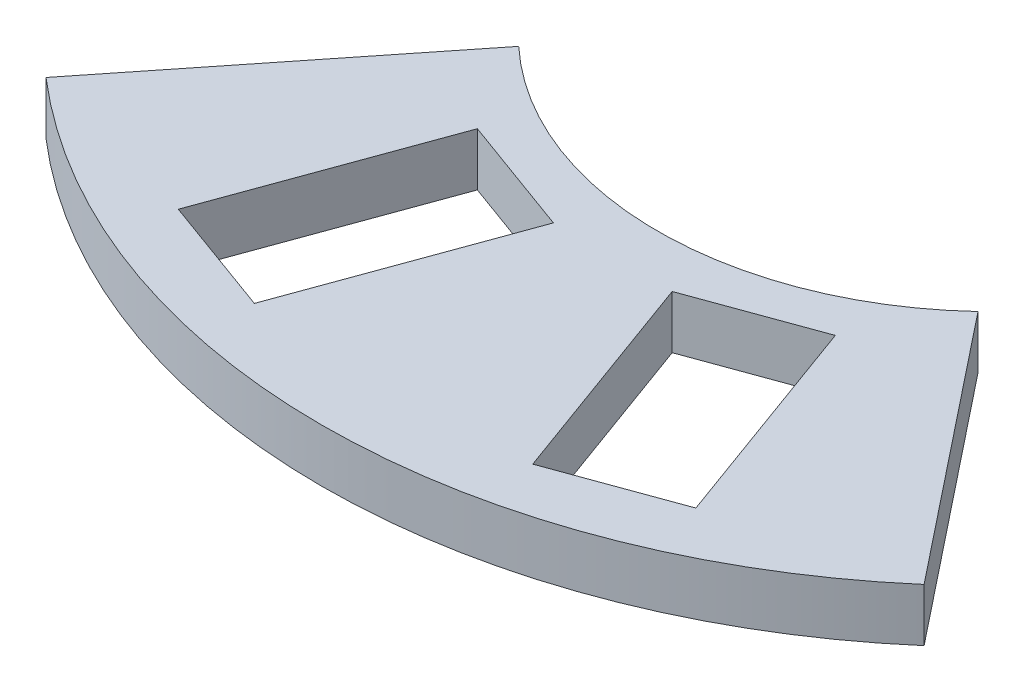
ISO-10303-21;
HEADER;
FILE_DESCRIPTION(('STEP AP214'),'2;1');
FILE_NAME('part.step','',(''),(''),'','','');
FILE_SCHEMA(('AUTOMOTIVE_DESIGN { 1 0 10303 214 1 1 1 1 }'));
ENDSEC;
DATA;
#1=APPLICATION_CONTEXT('core data for automotive mechanical design processes');
#2=APPLICATION_PROTOCOL_DEFINITION('international standard','automotive_design',2000,#1);
#3=PRODUCT_CONTEXT('',#1,'mechanical');
#4=PRODUCT('Part','Part','',(#3));
#5=PRODUCT_RELATED_PRODUCT_CATEGORY('part','',(#4));
#6=PRODUCT_DEFINITION_FORMATION('','',#4);
#7=PRODUCT_DEFINITION_CONTEXT('part definition',#1,'design');
#8=PRODUCT_DEFINITION('design','',#6,#7);
#9=PRODUCT_DEFINITION_SHAPE('','',#8);
#10=(LENGTH_UNIT() NAMED_UNIT(*) SI_UNIT(.MILLI.,.METRE.));
#11=(NAMED_UNIT(*) PLANE_ANGLE_UNIT() SI_UNIT($,.RADIAN.));
#12=(NAMED_UNIT(*) SI_UNIT($,.STERADIAN.) SOLID_ANGLE_UNIT());
#13=UNCERTAINTY_MEASURE_WITH_UNIT(LENGTH_MEASURE(1.E-05),#10,'distance_accuracy_value','');
#14=(GEOMETRIC_REPRESENTATION_CONTEXT(3) GLOBAL_UNCERTAINTY_ASSIGNED_CONTEXT((#13)) GLOBAL_UNIT_ASSIGNED_CONTEXT((#10,
#11,#12)) REPRESENTATION_CONTEXT('',''));
#15=CARTESIAN_POINT('',(0.,0.,0.));
#16=DIRECTION('',(0.,0.,1.));
#17=DIRECTION('',(1.,0.,0.));
#18=AXIS2_PLACEMENT_3D('',#15,#16,#17);
#19=CARTESIAN_POINT('',(0.,5.,-46.3080738993349));
#20=DIRECTION('',(0.,-1.,0.));
#21=DIRECTION('',(0.,0.,-1.));
#22=AXIS2_PLACEMENT_3D('',#19,#20,#21);
#23=PLANE('',#22);
#24=DIRECTION('',(0.342020143325669,0.,-0.939692620785908));
#25=VECTOR('',#24,1.);
#26=CARTESIAN_POINT('',(-13.1240658518669,5.,10.3216930332881));
#27=LINE('',#26,#25);
#28=CARTESIAN_POINT('',(-13.1240658518669,5.,10.3216930332881));
#29=VERTEX_POINT('',#28);
#30=CARTESIAN_POINT('',(-5.59962269870219,5.,-10.3515446240019));
#31=VERTEX_POINT('',#30);
#32=EDGE_CURVE('E161',#29,#31,#27,.T.);
#33=ORIENTED_EDGE('',*,*,#32,.F.);
#34=DIRECTION('',(0.939692620785908,0.,0.342020143325669));
#35=VECTOR('',#34,1.);
#36=CARTESIAN_POINT('',(-24.4003773012978,5.,6.21745131338006));
#37=LINE('',#36,#35);
#38=CARTESIAN_POINT('',(-24.4003773012978,5.,6.21745131338007));
#39=VERTEX_POINT('',#38);
#40=EDGE_CURVE('E169',#39,#29,#37,.T.);
#41=ORIENTED_EDGE('',*,*,#40,.F.);
#42=DIRECTION('',(-0.342020143325669,0.,0.939692620785908));
#43=VECTOR('',#42,1.);
#44=CARTESIAN_POINT('',(-24.4003773012978,5.,6.21745131338006));
#45=LINE('',#44,#43);
#46=CARTESIAN_POINT('',(-16.8759341481331,5.,-14.4557863439099));
#47=VERTEX_POINT('',#46);
#48=EDGE_CURVE('E166',#47,#39,#45,.T.);
#49=ORIENTED_EDGE('',*,*,#48,.F.);
#50=DIRECTION('',(-0.939692620785908,0.,-0.342020143325669));
#51=VECTOR('',#50,1.);
#52=CARTESIAN_POINT('',(-16.8759341481331,5.,-14.4557863439099));
#53=LINE('',#52,#51);
#54=EDGE_CURVE('E163',#31,#47,#53,.T.);
#55=ORIENTED_EDGE('',*,*,#54,.F.);
#56=EDGE_LOOP('',(#33,#41,#49,#55));
#57=FACE_BOUND('',#56,.T.);
#58=CARTESIAN_POINT('',(0.,5.,-46.3080738993349));
#59=DIRECTION('',(0.,-1.,0.));
#60=DIRECTION('',(0.,0.,-1.));
#61=AXIS2_PLACEMENT_3D('',#58,#59,#60);
#62=CIRCLE('',#61,31.7184001686182);
#63=CARTESIAN_POINT('',(21.6538678723969,5.,-23.1312122605932));
#64=VERTEX_POINT('',#63);
#65=CARTESIAN_POINT('',(-21.6538678723969,5.,-23.1312122605932));
#66=VERTEX_POINT('',#65);
#67=EDGE_CURVE('E192',#64,#66,#62,.T.);
#68=ORIENTED_EDGE('',*,*,#67,.T.);
#69=DIRECTION('',(-0.622418773256574,0.,0.782684400443616));
#70=VECTOR('',#69,1.);
#71=CARTESIAN_POINT('',(-21.6538678723969,5.,-23.1312122605932));
#72=LINE('',#71,#70);
#73=CARTESIAN_POINT('',(-41.3970299545099,5.,1.6955854535077));
#74=VERTEX_POINT('',#73);
#75=EDGE_CURVE('E195',#66,#74,#72,.T.);
#76=ORIENTED_EDGE('',*,*,#75,.T.);
#77=CARTESIAN_POINT('',(0.,5.,-46.3080738993349));
#78=DIRECTION('',(0.,1.,0.));
#79=DIRECTION('',(0.,0.,-1.));
#80=AXIS2_PLACEMENT_3D('',#77,#78,#79);
#81=CIRCLE('',#80,63.3882118403599);
#82=CARTESIAN_POINT('',(41.3970299545099,5.,1.69558545350768));
#83=VERTEX_POINT('',#82);
#84=EDGE_CURVE('E198',#74,#83,#81,.T.);
#85=ORIENTED_EDGE('',*,*,#84,.T.);
#86=DIRECTION('',(-0.622418773256574,0.,-0.782684400443616));
#87=VECTOR('',#86,1.);
#88=CARTESIAN_POINT('',(21.6538678723969,5.,-23.1312122605932));
#89=LINE('',#88,#87);
#90=EDGE_CURVE('E200',#83,#64,#89,.T.);
#91=ORIENTED_EDGE('',*,*,#90,.T.);
#92=EDGE_LOOP('',(#68,#76,#85,#91));
#93=FACE_BOUND('',#92,.T.);
#94=DIRECTION('',(-0.342020143325669,0.,-0.939692620785908));
#95=VECTOR('',#94,1.);
#96=CARTESIAN_POINT('',(24.4003773012978,5.,6.21745131338006));
#97=LINE('',#96,#95);
#98=CARTESIAN_POINT('',(24.4003773012978,5.,6.21745131338006));
#99=VERTEX_POINT('',#98);
#100=CARTESIAN_POINT('',(16.8759341481331,5.,-14.4557863439099));
#101=VERTEX_POINT('',#100);
#102=EDGE_CURVE('E125',#99,#101,#97,.T.);
#103=ORIENTED_EDGE('',*,*,#102,.F.);
#104=DIRECTION('',(0.939692620785908,0.,-0.342020143325669));
#105=VECTOR('',#104,1.);
#106=CARTESIAN_POINT('',(24.4003773012978,5.,6.21745131338006));
#107=LINE('',#106,#105);
#108=CARTESIAN_POINT('',(13.1240658518669,5.,10.3216930332881));
#109=VERTEX_POINT('',#108);
#110=EDGE_CURVE('E147',#109,#99,#107,.T.);
#111=ORIENTED_EDGE('',*,*,#110,.F.);
#112=DIRECTION('',(0.342020143325669,0.,0.939692620785908));
#113=VECTOR('',#112,1.);
#114=CARTESIAN_POINT('',(13.1240658518669,5.,10.3216930332881));
#115=LINE('',#114,#113);
#116=CARTESIAN_POINT('',(5.59962269870219,5.,-10.3515446240019));
#117=VERTEX_POINT('',#116);
#118=EDGE_CURVE('E145',#117,#109,#115,.T.);
#119=ORIENTED_EDGE('',*,*,#118,.F.);
#120=DIRECTION('',(-0.939692620785908,0.,0.342020143325669));
#121=VECTOR('',#120,1.);
#122=CARTESIAN_POINT('',(16.8759341481331,5.,-14.4557863439099));
#123=LINE('',#122,#121);
#124=EDGE_CURVE('E133',#101,#117,#123,.T.);
#125=ORIENTED_EDGE('',*,*,#124,.F.);
#126=EDGE_LOOP('',(#103,#111,#119,#125));
#127=FACE_BOUND('',#126,.T.);
#128=ADVANCED_FACE('F36',(#57,#93,#127),#23,.F.);
#129=CARTESIAN_POINT('',(0.,0.,-46.3080738993349));
#130=DIRECTION('',(0.,-1.,0.));
#131=DIRECTION('',(0.,0.,-1.));
#132=AXIS2_PLACEMENT_3D('',#129,#130,#131);
#133=PLANE('',#132);
#134=CARTESIAN_POINT('',(0.,0.,-46.3080738993349));
#135=DIRECTION('',(0.,-1.,0.));
#136=DIRECTION('',(0.,0.,-1.));
#137=AXIS2_PLACEMENT_3D('',#134,#135,#136);
#138=CIRCLE('',#137,31.7184001686182);
#139=CARTESIAN_POINT('',(21.6538678723969,0.,-23.1312122605932));
#140=VERTEX_POINT('',#139);
#141=CARTESIAN_POINT('',(-21.6538678723969,0.,-23.1312122605932));
#142=VERTEX_POINT('',#141);
#143=EDGE_CURVE('E191',#140,#142,#138,.T.);
#144=ORIENTED_EDGE('',*,*,#143,.F.);
#145=DIRECTION('',(-0.622418773256574,0.,-0.782684400443616));
#146=VECTOR('',#145,1.);
#147=CARTESIAN_POINT('',(21.6538678723969,0.,-23.1312122605932));
#148=LINE('',#147,#146);
#149=CARTESIAN_POINT('',(41.3970299545099,0.,1.69558545350768));
#150=VERTEX_POINT('',#149);
#151=EDGE_CURVE('E196',#150,#140,#148,.T.);
#152=ORIENTED_EDGE('',*,*,#151,.F.);
#153=CARTESIAN_POINT('',(0.,0.,-46.3080738993349));
#154=DIRECTION('',(0.,1.,0.));
#155=DIRECTION('',(0.,0.,-1.));
#156=AXIS2_PLACEMENT_3D('',#153,#154,#155);
#157=CIRCLE('',#156,63.3882118403599);
#158=CARTESIAN_POINT('',(-41.3970299545099,0.,1.6955854535077));
#159=VERTEX_POINT('',#158);
#160=EDGE_CURVE('E207',#159,#150,#157,.T.);
#161=ORIENTED_EDGE('',*,*,#160,.F.);
#162=DIRECTION('',(-0.622418773256574,0.,0.782684400443616));
#163=VECTOR('',#162,1.);
#164=CARTESIAN_POINT('',(-21.6538678723969,0.,-23.1312122605932));
#165=LINE('',#164,#163);
#166=EDGE_CURVE('E205',#142,#159,#165,.T.);
#167=ORIENTED_EDGE('',*,*,#166,.F.);
#168=EDGE_LOOP('',(#144,#152,#161,#167));
#169=FACE_BOUND('',#168,.T.);
#170=DIRECTION('',(0.939692620785908,0.,0.342020143325669));
#171=VECTOR('',#170,1.);
#172=CARTESIAN_POINT('',(-24.4003773012978,0.,6.21745131338006));
#173=LINE('',#172,#171);
#174=CARTESIAN_POINT('',(-24.4003773012978,0.,6.21745131338006));
#175=VERTEX_POINT('',#174);
#176=CARTESIAN_POINT('',(-13.1240658518669,0.,10.3216930332881));
#177=VERTEX_POINT('',#176);
#178=EDGE_CURVE('E164',#175,#177,#173,.T.);
#179=ORIENTED_EDGE('',*,*,#178,.T.);
#180=DIRECTION('',(0.342020143325669,0.,-0.939692620785908));
#181=VECTOR('',#180,1.);
#182=CARTESIAN_POINT('',(-13.1240658518669,0.,10.3216930332881));
#183=LINE('',#182,#181);
#184=CARTESIAN_POINT('',(-5.59962269870219,0.,-10.3515446240019));
#185=VERTEX_POINT('',#184);
#186=EDGE_CURVE('E141',#177,#185,#183,.T.);
#187=ORIENTED_EDGE('',*,*,#186,.T.);
#188=DIRECTION('',(-0.939692620785908,0.,-0.342020143325669));
#189=VECTOR('',#188,1.);
#190=CARTESIAN_POINT('',(-16.8759341481331,0.,-14.4557863439099));
#191=LINE('',#190,#189);
#192=CARTESIAN_POINT('',(-16.8759341481331,0.,-14.4557863439099));
#193=VERTEX_POINT('',#192);
#194=EDGE_CURVE('E174',#185,#193,#191,.T.);
#195=ORIENTED_EDGE('',*,*,#194,.T.);
#196=DIRECTION('',(-0.342020143325669,0.,0.939692620785908));
#197=VECTOR('',#196,1.);
#198=CARTESIAN_POINT('',(-24.4003773012978,0.,6.21745131338006));
#199=LINE('',#198,#197);
#200=EDGE_CURVE('E177',#193,#175,#199,.T.);
#201=ORIENTED_EDGE('',*,*,#200,.T.);
#202=EDGE_LOOP('',(#179,#187,#195,#201));
#203=FACE_BOUND('',#202,.T.);
#204=DIRECTION('',(0.939692620785908,0.,-0.342020143325669));
#205=VECTOR('',#204,1.);
#206=CARTESIAN_POINT('',(24.4003773012978,0.,6.21745131338006));
#207=LINE('',#206,#205);
#208=CARTESIAN_POINT('',(13.1240658518669,0.,10.3216930332881));
#209=VERTEX_POINT('',#208);
#210=CARTESIAN_POINT('',(24.4003773012978,0.,6.21745131338007));
#211=VERTEX_POINT('',#210);
#212=EDGE_CURVE('E134',#209,#211,#207,.T.);
#213=ORIENTED_EDGE('',*,*,#212,.T.);
#214=DIRECTION('',(-0.342020143325669,0.,-0.939692620785908));
#215=VECTOR('',#214,1.);
#216=CARTESIAN_POINT('',(24.4003773012978,0.,6.21745131338006));
#217=LINE('',#216,#215);
#218=CARTESIAN_POINT('',(16.8759341481331,0.,-14.4557863439099));
#219=VERTEX_POINT('',#218);
#220=EDGE_CURVE('E59',#211,#219,#217,.T.);
#221=ORIENTED_EDGE('',*,*,#220,.T.);
#222=DIRECTION('',(-0.939692620785908,0.,0.342020143325669));
#223=VECTOR('',#222,1.);
#224=CARTESIAN_POINT('',(16.8759341481331,0.,-14.4557863439099));
#225=LINE('',#224,#223);
#226=CARTESIAN_POINT('',(5.59962269870219,0.,-10.3515446240019));
#227=VERTEX_POINT('',#226);
#228=EDGE_CURVE('E140',#219,#227,#225,.T.);
#229=ORIENTED_EDGE('',*,*,#228,.T.);
#230=DIRECTION('',(0.342020143325669,0.,0.939692620785908));
#231=VECTOR('',#230,1.);
#232=CARTESIAN_POINT('',(13.1240658518669,0.,10.3216930332881));
#233=LINE('',#232,#231);
#234=EDGE_CURVE('E153',#227,#209,#233,.T.);
#235=ORIENTED_EDGE('',*,*,#234,.T.);
#236=EDGE_LOOP('',(#213,#221,#229,#235));
#237=FACE_BOUND('',#236,.T.);
#238=ADVANCED_FACE('F225',(#169,#203,#237),#133,.T.);
#239=CARTESIAN_POINT('',(0.,5.,-46.3080738993349));
#240=DIRECTION('',(0.,-1.,0.));
#241=DIRECTION('',(0.,0.,-1.));
#242=AXIS2_PLACEMENT_3D('',#239,#240,#241);
#243=CYLINDRICAL_SURFACE('',#242,31.7184001686182);
#244=ORIENTED_EDGE('',*,*,#143,.T.);
#245=DIRECTION('',(0.,-1.,0.));
#246=VECTOR('',#245,1.);
#247=CARTESIAN_POINT('',(-21.6538678723969,5.,-23.1312122605932));
#248=LINE('',#247,#246);
#249=EDGE_CURVE('E11',#66,#142,#248,.T.);
#250=ORIENTED_EDGE('',*,*,#249,.F.);
#251=ORIENTED_EDGE('',*,*,#67,.F.);
#252=DIRECTION('',(0.,-1.,0.));
#253=VECTOR('',#252,1.);
#254=CARTESIAN_POINT('',(21.6538678723969,5.,-23.1312122605932));
#255=LINE('',#254,#253);
#256=EDGE_CURVE('E202',#64,#140,#255,.T.);
#257=ORIENTED_EDGE('',*,*,#256,.T.);
#258=EDGE_LOOP('',(#244,#250,#251,#257));
#259=FACE_BOUND('',#258,.T.);
#260=ADVANCED_FACE('F38',(#259),#243,.F.);
#261=CARTESIAN_POINT('',(-21.6538678723969,5.,-23.1312122605932));
#262=DIRECTION('',(0.782684400443616,0.,0.622418773256574));
#263=DIRECTION('',(0.622418773256574,0.,-0.782684400443616));
#264=AXIS2_PLACEMENT_3D('',#261,#262,#263);
#265=PLANE('',#264);
#266=ORIENTED_EDGE('',*,*,#166,.T.);
#267=DIRECTION('',(0.,-1.,0.));
#268=VECTOR('',#267,1.);
#269=CARTESIAN_POINT('',(-41.3970299545099,5.,1.6955854535077));
#270=LINE('',#269,#268);
#271=EDGE_CURVE('E44',#74,#159,#270,.T.);
#272=ORIENTED_EDGE('',*,*,#271,.F.);
#273=ORIENTED_EDGE('',*,*,#75,.F.);
#274=ORIENTED_EDGE('',*,*,#249,.T.);
#275=EDGE_LOOP('',(#266,#272,#273,#274));
#276=FACE_BOUND('',#275,.T.);
#277=ADVANCED_FACE('F235',(#276),#265,.F.);
#278=CARTESIAN_POINT('',(0.,5.,-46.3080738993349));
#279=DIRECTION('',(0.,-1.,0.));
#280=DIRECTION('',(0.,0.,-1.));
#281=AXIS2_PLACEMENT_3D('',#278,#279,#280);
#282=CYLINDRICAL_SURFACE('',#281,63.3882118403599);
#283=ORIENTED_EDGE('',*,*,#160,.T.);
#284=DIRECTION('',(0.,-1.,0.));
#285=VECTOR('',#284,1.);
#286=CARTESIAN_POINT('',(41.3970299545099,5.,1.69558545350768));
#287=LINE('',#286,#285);
#288=EDGE_CURVE('E212',#83,#150,#287,.T.);
#289=ORIENTED_EDGE('',*,*,#288,.F.);
#290=ORIENTED_EDGE('',*,*,#84,.F.);
#291=ORIENTED_EDGE('',*,*,#271,.T.);
#292=EDGE_LOOP('',(#283,#289,#290,#291));
#293=FACE_BOUND('',#292,.T.);
#294=ADVANCED_FACE('F219',(#293),#282,.T.);
#295=CARTESIAN_POINT('',(21.6538678723969,5.,-23.1312122605932));
#296=DIRECTION('',(-0.782684400443616,0.,0.622418773256574));
#297=DIRECTION('',(0.622418773256574,0.,0.782684400443616));
#298=AXIS2_PLACEMENT_3D('',#295,#296,#297);
#299=PLANE('',#298);
#300=ORIENTED_EDGE('',*,*,#151,.T.);
#301=ORIENTED_EDGE('',*,*,#256,.F.);
#302=ORIENTED_EDGE('',*,*,#90,.F.);
#303=ORIENTED_EDGE('',*,*,#288,.T.);
#304=EDGE_LOOP('',(#300,#301,#302,#303));
#305=FACE_BOUND('',#304,.T.);
#306=ADVANCED_FACE('F229',(#305),#299,.F.);
#307=CARTESIAN_POINT('',(-13.1240658518669,5.,10.3216930332881));
#308=DIRECTION('',(-0.939692620785908,0.,-0.342020143325669));
#309=DIRECTION('',(-0.342020143325669,0.,0.939692620785908));
#310=AXIS2_PLACEMENT_3D('',#307,#308,#309);
#311=PLANE('',#310);
#312=ORIENTED_EDGE('',*,*,#186,.F.);
#313=DIRECTION('',(0.,-1.,0.));
#314=VECTOR('',#313,1.);
#315=CARTESIAN_POINT('',(-13.1240658518669,5.,10.3216930332881));
#316=LINE('',#315,#314);
#317=EDGE_CURVE('E171',#29,#177,#316,.T.);
#318=ORIENTED_EDGE('',*,*,#317,.F.);
#319=ORIENTED_EDGE('',*,*,#32,.T.);
#320=DIRECTION('',(0.,-1.,0.));
#321=VECTOR('',#320,1.);
#322=CARTESIAN_POINT('',(-5.59962269870219,5.,-10.3515446240019));
#323=LINE('',#322,#321);
#324=EDGE_CURVE('E188',#31,#185,#323,.T.);
#325=ORIENTED_EDGE('',*,*,#324,.T.);
#326=EDGE_LOOP('',(#312,#318,#319,#325));
#327=FACE_BOUND('',#326,.T.);
#328=ADVANCED_FACE('F251',(#327),#311,.T.);
#329=CARTESIAN_POINT('',(-16.8759341481331,5.,-14.4557863439099));
#330=DIRECTION('',(-0.342020143325669,0.,0.939692620785908));
#331=DIRECTION('',(0.939692620785908,0.,0.342020143325669));
#332=AXIS2_PLACEMENT_3D('',#329,#330,#331);
#333=PLANE('',#332);
#334=ORIENTED_EDGE('',*,*,#194,.F.);
#335=ORIENTED_EDGE('',*,*,#324,.F.);
#336=ORIENTED_EDGE('',*,*,#54,.T.);
#337=DIRECTION('',(0.,-1.,0.));
#338=VECTOR('',#337,1.);
#339=CARTESIAN_POINT('',(-16.8759341481331,5.,-14.4557863439099));
#340=LINE('',#339,#338);
#341=EDGE_CURVE('E186',#47,#193,#340,.T.);
#342=ORIENTED_EDGE('',*,*,#341,.T.);
#343=EDGE_LOOP('',(#334,#335,#336,#342));
#344=FACE_BOUND('',#343,.T.);
#345=ADVANCED_FACE('F258',(#344),#333,.T.);
#346=CARTESIAN_POINT('',(-24.4003773012978,5.,6.21745131338006));
#347=DIRECTION('',(0.939692620785908,0.,0.342020143325669));
#348=DIRECTION('',(0.342020143325669,0.,-0.939692620785908));
#349=AXIS2_PLACEMENT_3D('',#346,#347,#348);
#350=PLANE('',#349);
#351=ORIENTED_EDGE('',*,*,#200,.F.);
#352=ORIENTED_EDGE('',*,*,#341,.F.);
#353=ORIENTED_EDGE('',*,*,#48,.T.);
#354=DIRECTION('',(0.,-1.,0.));
#355=VECTOR('',#354,1.);
#356=CARTESIAN_POINT('',(-24.4003773012978,5.,6.21745131338006));
#357=LINE('',#356,#355);
#358=EDGE_CURVE('E184',#39,#175,#357,.T.);
#359=ORIENTED_EDGE('',*,*,#358,.T.);
#360=EDGE_LOOP('',(#351,#352,#353,#359));
#361=FACE_BOUND('',#360,.T.);
#362=ADVANCED_FACE('F263',(#361),#350,.T.);
#363=CARTESIAN_POINT('',(-24.4003773012978,5.,6.21745131338006));
#364=DIRECTION('',(0.342020143325669,0.,-0.939692620785908));
#365=DIRECTION('',(-0.939692620785908,0.,-0.342020143325669));
#366=AXIS2_PLACEMENT_3D('',#363,#364,#365);
#367=PLANE('',#366);
#368=ORIENTED_EDGE('',*,*,#178,.F.);
#369=ORIENTED_EDGE('',*,*,#358,.F.);
#370=ORIENTED_EDGE('',*,*,#40,.T.);
#371=ORIENTED_EDGE('',*,*,#317,.T.);
#372=EDGE_LOOP('',(#368,#369,#370,#371));
#373=FACE_BOUND('',#372,.T.);
#374=ADVANCED_FACE('F269',(#373),#367,.T.);
#375=CARTESIAN_POINT('',(24.4003773012978,5.,6.21745131338006));
#376=DIRECTION('',(-0.939692620785908,0.,0.342020143325669));
#377=DIRECTION('',(0.342020143325669,0.,0.939692620785908));
#378=AXIS2_PLACEMENT_3D('',#375,#376,#377);
#379=PLANE('',#378);
#380=ORIENTED_EDGE('',*,*,#220,.F.);
#381=DIRECTION('',(0.,-1.,0.));
#382=VECTOR('',#381,1.);
#383=CARTESIAN_POINT('',(24.4003773012978,5.,6.21745131338006));
#384=LINE('',#383,#382);
#385=EDGE_CURVE('E129',#99,#211,#384,.T.);
#386=ORIENTED_EDGE('',*,*,#385,.F.);
#387=ORIENTED_EDGE('',*,*,#102,.T.);
#388=DIRECTION('',(0.,-1.,0.));
#389=VECTOR('',#388,1.);
#390=CARTESIAN_POINT('',(16.8759341481331,5.,-14.4557863439099));
#391=LINE('',#390,#389);
#392=EDGE_CURVE('E128',#101,#219,#391,.T.);
#393=ORIENTED_EDGE('',*,*,#392,.T.);
#394=EDGE_LOOP('',(#380,#386,#387,#393));
#395=FACE_BOUND('',#394,.T.);
#396=ADVANCED_FACE('F127',(#395),#379,.T.);
#397=CARTESIAN_POINT('',(16.8759341481331,5.,-14.4557863439099));
#398=DIRECTION('',(0.342020143325669,0.,0.939692620785908));
#399=DIRECTION('',(0.939692620785908,0.,-0.342020143325669));
#400=AXIS2_PLACEMENT_3D('',#397,#398,#399);
#401=PLANE('',#400);
#402=ORIENTED_EDGE('',*,*,#228,.F.);
#403=ORIENTED_EDGE('',*,*,#392,.F.);
#404=ORIENTED_EDGE('',*,*,#124,.T.);
#405=DIRECTION('',(0.,-1.,0.));
#406=VECTOR('',#405,1.);
#407=CARTESIAN_POINT('',(5.59962269870219,5.,-10.3515446240019));
#408=LINE('',#407,#406);
#409=EDGE_CURVE('E142',#117,#227,#408,.T.);
#410=ORIENTED_EDGE('',*,*,#409,.T.);
#411=EDGE_LOOP('',(#402,#403,#404,#410));
#412=FACE_BOUND('',#411,.T.);
#413=ADVANCED_FACE('F137',(#412),#401,.T.);
#414=CARTESIAN_POINT('',(13.1240658518669,5.,10.3216930332881));
#415=DIRECTION('',(0.939692620785908,0.,-0.342020143325669));
#416=DIRECTION('',(-0.342020143325669,0.,-0.939692620785908));
#417=AXIS2_PLACEMENT_3D('',#414,#415,#416);
#418=PLANE('',#417);
#419=ORIENTED_EDGE('',*,*,#234,.F.);
#420=ORIENTED_EDGE('',*,*,#409,.F.);
#421=ORIENTED_EDGE('',*,*,#118,.T.);
#422=DIRECTION('',(0.,-1.,0.));
#423=VECTOR('',#422,1.);
#424=CARTESIAN_POINT('',(13.1240658518669,5.,10.3216930332881));
#425=LINE('',#424,#423);
#426=EDGE_CURVE('E51',#109,#209,#425,.T.);
#427=ORIENTED_EDGE('',*,*,#426,.T.);
#428=EDGE_LOOP('',(#419,#420,#421,#427));
#429=FACE_BOUND('',#428,.T.);
#430=ADVANCED_FACE('F288',(#429),#418,.T.);
#431=CARTESIAN_POINT('',(24.4003773012978,5.,6.21745131338006));
#432=DIRECTION('',(-0.342020143325669,0.,-0.939692620785908));
#433=DIRECTION('',(-0.939692620785908,0.,0.342020143325669));
#434=AXIS2_PLACEMENT_3D('',#431,#432,#433);
#435=PLANE('',#434);
#436=ORIENTED_EDGE('',*,*,#212,.F.);
#437=ORIENTED_EDGE('',*,*,#426,.F.);
#438=ORIENTED_EDGE('',*,*,#110,.T.);
#439=ORIENTED_EDGE('',*,*,#385,.T.);
#440=EDGE_LOOP('',(#436,#437,#438,#439));
#441=FACE_BOUND('',#440,.T.);
#442=ADVANCED_FACE('F291',(#441),#435,.T.);
#443=CLOSED_SHELL('',(#128,#238,#260,#277,#294,#306,#328,#345,#362,#374,#396,#413,#430,#442));
#444=MANIFOLD_SOLID_BREP('B2',#443);
#445=ADVANCED_BREP_SHAPE_REPRESENTATION('',(#18,#444),#14);
#446=SHAPE_DEFINITION_REPRESENTATION(#9,#445);
ENDSEC;
END-ISO-10303-21;
